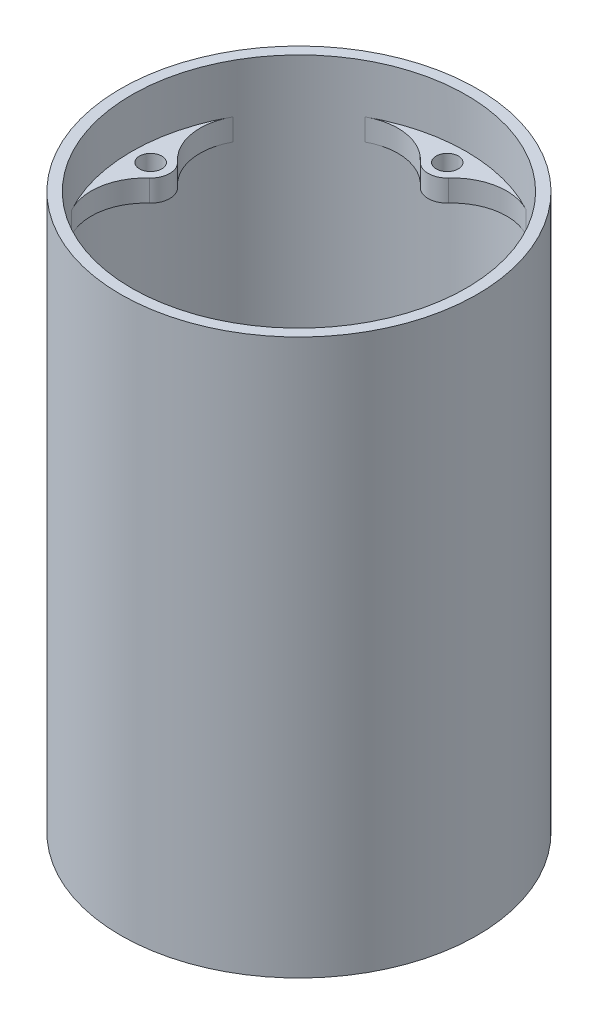
ISO-10303-21;
HEADER;
FILE_DESCRIPTION(('STEP AP214'),'2;1');
FILE_NAME('part.step','',(''),(''),'','','');
FILE_SCHEMA(('AUTOMOTIVE_DESIGN { 1 0 10303 214 1 1 1 1 }'));
ENDSEC;
DATA;
#1=APPLICATION_CONTEXT('core data for automotive mechanical design processes');
#2=APPLICATION_PROTOCOL_DEFINITION('international standard','automotive_design',2000,#1);
#3=PRODUCT_CONTEXT('',#1,'mechanical');
#4=PRODUCT('Part','Part','',(#3));
#5=PRODUCT_RELATED_PRODUCT_CATEGORY('part','',(#4));
#6=PRODUCT_DEFINITION_FORMATION('','',#4);
#7=PRODUCT_DEFINITION_CONTEXT('part definition',#1,'design');
#8=PRODUCT_DEFINITION('design','',#6,#7);
#9=PRODUCT_DEFINITION_SHAPE('','',#8);
#10=(LENGTH_UNIT() NAMED_UNIT(*) SI_UNIT(.MILLI.,.METRE.));
#11=(NAMED_UNIT(*) PLANE_ANGLE_UNIT() SI_UNIT($,.RADIAN.));
#12=(NAMED_UNIT(*) SI_UNIT($,.STERADIAN.) SOLID_ANGLE_UNIT());
#13=UNCERTAINTY_MEASURE_WITH_UNIT(LENGTH_MEASURE(1.E-05),#10,'distance_accuracy_value','');
#14=(GEOMETRIC_REPRESENTATION_CONTEXT(3) GLOBAL_UNCERTAINTY_ASSIGNED_CONTEXT((#13)) GLOBAL_UNIT_ASSIGNED_CONTEXT((#10,
#11,#12)) REPRESENTATION_CONTEXT('',''));
#15=CARTESIAN_POINT('',(0.,0.,0.));
#16=DIRECTION('',(0.,0.,1.));
#17=DIRECTION('',(1.,0.,0.));
#18=AXIS2_PLACEMENT_3D('',#15,#16,#17);
#19=CARTESIAN_POINT('',(0.,102.,0.));
#20=DIRECTION('',(0.,-1.,0.));
#21=DIRECTION('',(0.,0.,-1.));
#22=AXIS2_PLACEMENT_3D('',#19,#20,#21);
#23=CYLINDRICAL_SURFACE('',#22,30.75);
#24=CARTESIAN_POINT('',(0.,102.,0.));
#25=DIRECTION('',(0.,1.,0.));
#26=DIRECTION('',(0.,0.,1.));
#27=AXIS2_PLACEMENT_3D('',#24,#25,#26);
#28=CIRCLE('',#27,30.75);
#29=CARTESIAN_POINT('',(0.,102.,30.75));
#30=VERTEX_POINT('',#29);
#31=EDGE_CURVE('E330',#30,#30,#28,.T.);
#32=ORIENTED_EDGE('',*,*,#31,.T.);
#33=EDGE_LOOP('',(#32));
#34=FACE_BOUND('',#33,.T.);
#35=CARTESIAN_POINT('',(0.,0.,0.));
#36=DIRECTION('',(0.,1.,0.));
#37=DIRECTION('',(0.,0.,1.));
#38=AXIS2_PLACEMENT_3D('',#35,#36,#37);
#39=CIRCLE('',#38,30.75);
#40=CARTESIAN_POINT('',(0.,0.,30.75));
#41=VERTEX_POINT('',#40);
#42=EDGE_CURVE('E327',#41,#41,#39,.T.);
#43=ORIENTED_EDGE('',*,*,#42,.F.);
#44=EDGE_LOOP('',(#43));
#45=FACE_BOUND('',#44,.T.);
#46=CARTESIAN_POINT('',(0.,93.,0.));
#47=DIRECTION('',(0.,1.,0.));
#48=DIRECTION('',(0.,0.,1.));
#49=AXIS2_PLACEMENT_3D('',#46,#47,#48);
#50=CIRCLE('',#49,30.75);
#51=CARTESIAN_POINT('',(14.8197760235976,93.,-26.9432132198519));
#52=VERTEX_POINT('',#51);
#53=CARTESIAN_POINT('',(-14.8197760235976,93.,-26.9432132198519));
#54=VERTEX_POINT('',#53);
#55=EDGE_CURVE('E258',#52,#54,#50,.T.);
#56=ORIENTED_EDGE('',*,*,#55,.F.);
#57=DIRECTION('',(0.,-1.,0.));
#58=VECTOR('',#57,1.);
#59=CARTESIAN_POINT('',(14.8197760235976,102.,-26.9432132198519));
#60=LINE('',#59,#58);
#61=CARTESIAN_POINT('',(14.8197760235976,89.,-26.9432132198519));
#62=VERTEX_POINT('',#61);
#63=EDGE_CURVE('E188',#52,#62,#60,.T.);
#64=ORIENTED_EDGE('',*,*,#63,.T.);
#65=CARTESIAN_POINT('',(0.,89.,0.));
#66=DIRECTION('',(0.,1.,0.));
#67=DIRECTION('',(0.,0.,1.));
#68=AXIS2_PLACEMENT_3D('',#65,#66,#67);
#69=CIRCLE('',#68,30.75);
#70=CARTESIAN_POINT('',(-14.8197760235976,89.,-26.9432132198519));
#71=VERTEX_POINT('',#70);
#72=EDGE_CURVE('E253',#62,#71,#69,.T.);
#73=ORIENTED_EDGE('',*,*,#72,.T.);
#74=DIRECTION('',(0.,-1.,0.));
#75=VECTOR('',#74,1.);
#76=CARTESIAN_POINT('',(-14.8197760235976,102.,-26.9432132198519));
#77=LINE('',#76,#75);
#78=EDGE_CURVE('E180',#71,#54,#77,.F.);
#79=ORIENTED_EDGE('',*,*,#78,.T.);
#80=EDGE_LOOP('',(#56,#64,#73,#79));
#81=FACE_BOUND('',#80,.T.);
#82=CARTESIAN_POINT('',(0.,93.,0.));
#83=DIRECTION('',(0.,1.,0.));
#84=DIRECTION('',(0.,0.,1.));
#85=AXIS2_PLACEMENT_3D('',#82,#83,#84);
#86=CIRCLE('',#85,30.75);
#87=CARTESIAN_POINT('',(26.9432132198518,93.,14.8197760235977));
#88=VERTEX_POINT('',#87);
#89=CARTESIAN_POINT('',(26.9432132198519,93.,-14.8197760235975));
#90=VERTEX_POINT('',#89);
#91=EDGE_CURVE('E156',#88,#90,#86,.T.);
#92=ORIENTED_EDGE('',*,*,#91,.F.);
#93=DIRECTION('',(0.,-1.,0.));
#94=VECTOR('',#93,1.);
#95=CARTESIAN_POINT('',(26.9432132198518,102.,14.8197760235977));
#96=LINE('',#95,#94);
#97=CARTESIAN_POINT('',(26.9432132198518,89.,14.8197760235977));
#98=VERTEX_POINT('',#97);
#99=EDGE_CURVE('E205',#88,#98,#96,.T.);
#100=ORIENTED_EDGE('',*,*,#99,.T.);
#101=CARTESIAN_POINT('',(0.,89.,0.));
#102=DIRECTION('',(0.,1.,0.));
#103=DIRECTION('',(0.,0.,1.));
#104=AXIS2_PLACEMENT_3D('',#101,#102,#103);
#105=CIRCLE('',#104,30.75);
#106=CARTESIAN_POINT('',(26.9432132198519,89.,-14.8197760235975));
#107=VERTEX_POINT('',#106);
#108=EDGE_CURVE('E261',#98,#107,#105,.T.);
#109=ORIENTED_EDGE('',*,*,#108,.T.);
#110=DIRECTION('',(0.,-1.,0.));
#111=VECTOR('',#110,1.);
#112=CARTESIAN_POINT('',(26.9432132198519,102.,-14.8197760235975));
#113=LINE('',#112,#111);
#114=EDGE_CURVE('E203',#107,#90,#113,.F.);
#115=ORIENTED_EDGE('',*,*,#114,.T.);
#116=EDGE_LOOP('',(#92,#100,#109,#115));
#117=FACE_BOUND('',#116,.T.);
#118=CARTESIAN_POINT('',(0.,93.,0.));
#119=DIRECTION('',(0.,1.,0.));
#120=DIRECTION('',(0.,0.,1.));
#121=AXIS2_PLACEMENT_3D('',#118,#119,#120);
#122=CIRCLE('',#121,30.75);
#123=CARTESIAN_POINT('',(-14.8197760235978,93.,26.9432132198518));
#124=VERTEX_POINT('',#123);
#125=CARTESIAN_POINT('',(14.8197760235974,93.,26.943213219852));
#126=VERTEX_POINT('',#125);
#127=EDGE_CURVE('E268',#124,#126,#122,.T.);
#128=ORIENTED_EDGE('',*,*,#127,.F.);
#129=DIRECTION('',(0.,-1.,0.));
#130=VECTOR('',#129,1.);
#131=CARTESIAN_POINT('',(-14.8197760235978,102.,26.9432132198518));
#132=LINE('',#131,#130);
#133=CARTESIAN_POINT('',(-14.8197760235978,89.,26.9432132198518));
#134=VERTEX_POINT('',#133);
#135=EDGE_CURVE('E200',#124,#134,#132,.T.);
#136=ORIENTED_EDGE('',*,*,#135,.T.);
#137=CARTESIAN_POINT('',(0.,89.,0.));
#138=DIRECTION('',(0.,1.,0.));
#139=DIRECTION('',(0.,0.,1.));
#140=AXIS2_PLACEMENT_3D('',#137,#138,#139);
#141=CIRCLE('',#140,30.75);
#142=CARTESIAN_POINT('',(14.8197760235974,89.,26.943213219852));
#143=VERTEX_POINT('',#142);
#144=EDGE_CURVE('E270',#134,#143,#141,.T.);
#145=ORIENTED_EDGE('',*,*,#144,.T.);
#146=DIRECTION('',(0.,-1.,0.));
#147=VECTOR('',#146,1.);
#148=CARTESIAN_POINT('',(14.8197760235974,102.,26.943213219852));
#149=LINE('',#148,#147);
#150=EDGE_CURVE('E197',#143,#126,#149,.F.);
#151=ORIENTED_EDGE('',*,*,#150,.T.);
#152=EDGE_LOOP('',(#128,#136,#145,#151));
#153=FACE_BOUND('',#152,.T.);
#154=CARTESIAN_POINT('',(0.,93.,0.));
#155=DIRECTION('',(0.,1.,0.));
#156=DIRECTION('',(0.,0.,1.));
#157=AXIS2_PLACEMENT_3D('',#154,#155,#156);
#158=CIRCLE('',#157,30.75);
#159=CARTESIAN_POINT('',(-26.9432132198517,93.,-14.8197760235979));
#160=VERTEX_POINT('',#159);
#161=CARTESIAN_POINT('',(-26.943213219852,93.,14.8197760235973));
#162=VERTEX_POINT('',#161);
#163=EDGE_CURVE('E182',#160,#162,#158,.T.);
#164=ORIENTED_EDGE('',*,*,#163,.F.);
#165=DIRECTION('',(0.,-1.,0.));
#166=VECTOR('',#165,1.);
#167=CARTESIAN_POINT('',(-26.9432132198517,102.,-14.8197760235979));
#168=LINE('',#167,#166);
#169=CARTESIAN_POINT('',(-26.9432132198517,89.,-14.8197760235979));
#170=VERTEX_POINT('',#169);
#171=EDGE_CURVE('E194',#160,#170,#168,.T.);
#172=ORIENTED_EDGE('',*,*,#171,.T.);
#173=CARTESIAN_POINT('',(0.,89.,0.));
#174=DIRECTION('',(0.,1.,0.));
#175=DIRECTION('',(0.,0.,1.));
#176=AXIS2_PLACEMENT_3D('',#173,#174,#175);
#177=CIRCLE('',#176,30.75);
#178=CARTESIAN_POINT('',(-26.943213219852,89.,14.8197760235973));
#179=VERTEX_POINT('',#178);
#180=EDGE_CURVE('E178',#170,#179,#177,.T.);
#181=ORIENTED_EDGE('',*,*,#180,.T.);
#182=DIRECTION('',(0.,-1.,0.));
#183=VECTOR('',#182,1.);
#184=CARTESIAN_POINT('',(-26.9432132198521,102.,14.8197760235973));
#185=LINE('',#184,#183);
#186=EDGE_CURVE('E191',#179,#162,#185,.F.);
#187=ORIENTED_EDGE('',*,*,#186,.T.);
#188=EDGE_LOOP('',(#164,#172,#181,#187));
#189=FACE_BOUND('',#188,.T.);
#190=ADVANCED_FACE('F37',(#34,#45,#81,#117,#153,#189),#23,.F.);
#191=CARTESIAN_POINT('',(0.,102.,0.));
#192=DIRECTION('',(0.,1.,0.));
#193=DIRECTION('',(0.,0.,1.));
#194=AXIS2_PLACEMENT_3D('',#191,#192,#193);
#195=PLANE('',#194);
#196=CARTESIAN_POINT('',(0.,102.,0.));
#197=DIRECTION('',(0.,1.,0.));
#198=DIRECTION('',(0.,0.,1.));
#199=AXIS2_PLACEMENT_3D('',#196,#197,#198);
#200=CIRCLE('',#199,32.75);
#201=CARTESIAN_POINT('',(0.,102.,32.75));
#202=VERTEX_POINT('',#201);
#203=EDGE_CURVE('E263',#202,#202,#200,.T.);
#204=ORIENTED_EDGE('',*,*,#203,.T.);
#205=EDGE_LOOP('',(#204));
#206=FACE_BOUND('',#205,.T.);
#207=ORIENTED_EDGE('',*,*,#31,.F.);
#208=EDGE_LOOP('',(#207));
#209=FACE_BOUND('',#208,.T.);
#210=ADVANCED_FACE('F345',(#206,#209),#195,.T.);
#211=CARTESIAN_POINT('',(0.,0.,0.));
#212=DIRECTION('',(0.,1.,0.));
#213=DIRECTION('',(0.,0.,1.));
#214=AXIS2_PLACEMENT_3D('',#211,#212,#213);
#215=PLANE('',#214);
#216=CARTESIAN_POINT('',(0.,0.,0.));
#217=DIRECTION('',(0.,1.,0.));
#218=DIRECTION('',(0.,0.,1.));
#219=AXIS2_PLACEMENT_3D('',#216,#217,#218);
#220=CIRCLE('',#219,32.75);
#221=CARTESIAN_POINT('',(0.,0.,32.75));
#222=VERTEX_POINT('',#221);
#223=EDGE_CURVE('E333',#222,#222,#220,.T.);
#224=ORIENTED_EDGE('',*,*,#223,.F.);
#225=EDGE_LOOP('',(#224));
#226=FACE_BOUND('',#225,.T.);
#227=ORIENTED_EDGE('',*,*,#42,.T.);
#228=EDGE_LOOP('',(#227));
#229=FACE_BOUND('',#228,.T.);
#230=ADVANCED_FACE('F342',(#226,#229),#215,.F.);
#231=CARTESIAN_POINT('',(0.,102.,0.));
#232=DIRECTION('',(0.,-1.,0.));
#233=DIRECTION('',(0.,0.,-1.));
#234=AXIS2_PLACEMENT_3D('',#231,#232,#233);
#235=CYLINDRICAL_SURFACE('',#234,32.75);
#236=ORIENTED_EDGE('',*,*,#203,.F.);
#237=EDGE_LOOP('',(#236));
#238=FACE_BOUND('',#237,.T.);
#239=ORIENTED_EDGE('',*,*,#223,.T.);
#240=EDGE_LOOP('',(#239));
#241=FACE_BOUND('',#240,.T.);
#242=ADVANCED_FACE('F340',(#238,#241),#235,.T.);
#243=CARTESIAN_POINT('',(0.,89.,-27.25));
#244=DIRECTION('',(0.,1.,0.));
#245=DIRECTION('',(0.,0.,1.));
#246=AXIS2_PLACEMENT_3D('',#243,#244,#245);
#247=PLANE('',#246);
#248=CARTESIAN_POINT('',(0.,89.,-27.25));
#249=DIRECTION('',(0.,1.,0.));
#250=DIRECTION('',(0.,0.,1.));
#251=AXIS2_PLACEMENT_3D('',#248,#249,#250);
#252=CIRCLE('',#251,2.05);
#253=CARTESIAN_POINT('',(0.,89.,-25.2));
#254=VERTEX_POINT('',#253);
#255=EDGE_CURVE('E320',#254,#254,#252,.T.);
#256=ORIENTED_EDGE('',*,*,#255,.T.);
#257=EDGE_LOOP('',(#256));
#258=FACE_BOUND('',#257,.T.);
#259=ORIENTED_EDGE('',*,*,#72,.F.);
#260=CARTESIAN_POINT('',(10.0003366663301,89.,-18.1811926605505));
#261=DIRECTION('',(0.,1.,0.));
#262=DIRECTION('',(0.,0.,1.));
#263=AXIS2_PLACEMENT_3D('',#260,#261,#262);
#264=CIRCLE('',#263,10.);
#265=CARTESIAN_POINT('',(2.59267987645595,89.,-24.8988277268094));
#266=VERTEX_POINT('',#265);
#267=EDGE_CURVE('E52',#62,#266,#264,.T.);
#268=ORIENTED_EDGE('',*,*,#267,.T.);
#269=CARTESIAN_POINT('',(0.,89.,-27.25));
#270=DIRECTION('',(0.,1.,0.));
#271=DIRECTION('',(0.,0.,1.));
#272=AXIS2_PLACEMENT_3D('',#269,#270,#271);
#273=CIRCLE('',#272,3.5);
#274=CARTESIAN_POINT('',(-2.59267987645595,89.,-24.8988277268094));
#275=VERTEX_POINT('',#274);
#276=EDGE_CURVE('E254',#275,#266,#273,.T.);
#277=ORIENTED_EDGE('',*,*,#276,.F.);
#278=CARTESIAN_POINT('',(-10.0003366663301,89.,-18.1811926605505));
#279=DIRECTION('',(0.,1.,0.));
#280=DIRECTION('',(0.,0.,1.));
#281=AXIS2_PLACEMENT_3D('',#278,#279,#280);
#282=CIRCLE('',#281,10.);
#283=EDGE_CURVE('E45',#275,#71,#282,.T.);
#284=ORIENTED_EDGE('',*,*,#283,.T.);
#285=EDGE_LOOP('',(#259,#268,#277,#284));
#286=FACE_BOUND('',#285,.T.);
#287=ADVANCED_FACE('F252',(#258,#286),#247,.F.);
#288=CARTESIAN_POINT('',(0.,93.,-27.25));
#289=DIRECTION('',(0.,1.,0.));
#290=DIRECTION('',(0.,0.,1.));
#291=AXIS2_PLACEMENT_3D('',#288,#289,#290);
#292=PLANE('',#291);
#293=CARTESIAN_POINT('',(0.,93.,-27.25));
#294=DIRECTION('',(0.,1.,0.));
#295=DIRECTION('',(0.,0.,1.));
#296=AXIS2_PLACEMENT_3D('',#293,#294,#295);
#297=CIRCLE('',#296,2.05);
#298=CARTESIAN_POINT('',(0.,93.,-25.2));
#299=VERTEX_POINT('',#298);
#300=EDGE_CURVE('E317',#299,#299,#297,.T.);
#301=ORIENTED_EDGE('',*,*,#300,.F.);
#302=EDGE_LOOP('',(#301));
#303=FACE_BOUND('',#302,.T.);
#304=CARTESIAN_POINT('',(0.,93.,-27.25));
#305=DIRECTION('',(0.,1.,0.));
#306=DIRECTION('',(0.,0.,1.));
#307=AXIS2_PLACEMENT_3D('',#304,#305,#306);
#308=CIRCLE('',#307,3.5);
#309=CARTESIAN_POINT('',(-2.59267987645595,93.,-24.8988277268094));
#310=VERTEX_POINT('',#309);
#311=CARTESIAN_POINT('',(2.59267987645595,93.,-24.8988277268094));
#312=VERTEX_POINT('',#311);
#313=EDGE_CURVE('E323',#310,#312,#308,.T.);
#314=ORIENTED_EDGE('',*,*,#313,.T.);
#315=CARTESIAN_POINT('',(10.0003366663301,93.,-18.1811926605505));
#316=DIRECTION('',(0.,1.,0.));
#317=DIRECTION('',(0.,0.,1.));
#318=AXIS2_PLACEMENT_3D('',#315,#316,#317);
#319=CIRCLE('',#318,10.);
#320=EDGE_CURVE('E249',#312,#52,#319,.F.);
#321=ORIENTED_EDGE('',*,*,#320,.T.);
#322=ORIENTED_EDGE('',*,*,#55,.T.);
#323=CARTESIAN_POINT('',(-10.0003366663301,93.,-18.1811926605505));
#324=DIRECTION('',(0.,1.,0.));
#325=DIRECTION('',(0.,0.,1.));
#326=AXIS2_PLACEMENT_3D('',#323,#324,#325);
#327=CIRCLE('',#326,10.);
#328=EDGE_CURVE('E11',#54,#310,#327,.F.);
#329=ORIENTED_EDGE('',*,*,#328,.T.);
#330=EDGE_LOOP('',(#314,#321,#322,#329));
#331=FACE_BOUND('',#330,.T.);
#332=ADVANCED_FACE('F396',(#303,#331),#292,.T.);
#333=CARTESIAN_POINT('',(0.,89.,-27.25));
#334=DIRECTION('',(0.,1.,0.));
#335=DIRECTION('',(0.,0.,1.));
#336=AXIS2_PLACEMENT_3D('',#333,#334,#335);
#337=CYLINDRICAL_SURFACE('',#336,3.5);
#338=ORIENTED_EDGE('',*,*,#276,.T.);
#339=DIRECTION('',(0.,1.,0.));
#340=VECTOR('',#339,1.);
#341=CARTESIAN_POINT('',(2.59267987645595,89.,-24.8988277268094));
#342=LINE('',#341,#340);
#343=EDGE_CURVE('E222',#266,#312,#342,.T.);
#344=ORIENTED_EDGE('',*,*,#343,.T.);
#345=ORIENTED_EDGE('',*,*,#313,.F.);
#346=DIRECTION('',(0.,1.,0.));
#347=VECTOR('',#346,1.);
#348=CARTESIAN_POINT('',(-2.59267987645595,89.,-24.8988277268094));
#349=LINE('',#348,#347);
#350=EDGE_CURVE('E220',#310,#275,#349,.F.);
#351=ORIENTED_EDGE('',*,*,#350,.T.);
#352=EDGE_LOOP('',(#338,#344,#345,#351));
#353=FACE_BOUND('',#352,.T.);
#354=ADVANCED_FACE('F360',(#353),#337,.T.);
#355=CARTESIAN_POINT('',(0.,89.,-27.25));
#356=DIRECTION('',(0.,1.,0.));
#357=DIRECTION('',(0.,0.,1.));
#358=AXIS2_PLACEMENT_3D('',#355,#356,#357);
#359=CYLINDRICAL_SURFACE('',#358,2.05);
#360=ORIENTED_EDGE('',*,*,#255,.F.);
#361=EDGE_LOOP('',(#360));
#362=FACE_BOUND('',#361,.T.);
#363=ORIENTED_EDGE('',*,*,#300,.T.);
#364=EDGE_LOOP('',(#363));
#365=FACE_BOUND('',#364,.T.);
#366=ADVANCED_FACE('F402',(#362,#365),#359,.F.);
#367=CARTESIAN_POINT('',(27.25,89.,0.));
#368=DIRECTION('',(0.,1.,0.));
#369=DIRECTION('',(0.,0.,1.));
#370=AXIS2_PLACEMENT_3D('',#367,#368,#369);
#371=PLANE('',#370);
#372=CARTESIAN_POINT('',(27.25,89.,0.));
#373=DIRECTION('',(0.,1.,0.));
#374=DIRECTION('',(0.,0.,1.));
#375=AXIS2_PLACEMENT_3D('',#372,#373,#374);
#376=CIRCLE('',#375,2.05);
#377=CARTESIAN_POINT('',(27.25,89.,2.0500000000001));
#378=VERTEX_POINT('',#377);
#379=EDGE_CURVE('E173',#378,#378,#376,.T.);
#380=ORIENTED_EDGE('',*,*,#379,.T.);
#381=EDGE_LOOP('',(#380));
#382=FACE_BOUND('',#381,.T.);
#383=ORIENTED_EDGE('',*,*,#108,.F.);
#384=CARTESIAN_POINT('',(18.1811926605504,89.,10.0003366663302));
#385=DIRECTION('',(0.,1.,0.));
#386=DIRECTION('',(0.,0.,1.));
#387=AXIS2_PLACEMENT_3D('',#384,#385,#386);
#388=CIRCLE('',#387,10.);
#389=CARTESIAN_POINT('',(24.8988277268094,89.,2.59267987645604));
#390=VERTEX_POINT('',#389);
#391=EDGE_CURVE('E227',#98,#390,#388,.T.);
#392=ORIENTED_EDGE('',*,*,#391,.T.);
#393=CARTESIAN_POINT('',(27.25,89.,0.));
#394=DIRECTION('',(0.,1.,0.));
#395=DIRECTION('',(0.,0.,1.));
#396=AXIS2_PLACEMENT_3D('',#393,#394,#395);
#397=CIRCLE('',#396,3.5);
#398=CARTESIAN_POINT('',(24.8988277268094,89.,-2.59267987645586));
#399=VERTEX_POINT('',#398);
#400=EDGE_CURVE('E174',#399,#390,#397,.T.);
#401=ORIENTED_EDGE('',*,*,#400,.F.);
#402=CARTESIAN_POINT('',(18.1811926605505,89.,-10.00033666633));
#403=DIRECTION('',(0.,1.,0.));
#404=DIRECTION('',(0.,0.,1.));
#405=AXIS2_PLACEMENT_3D('',#402,#403,#404);
#406=CIRCLE('',#405,10.);
#407=EDGE_CURVE('E162',#399,#107,#406,.T.);
#408=ORIENTED_EDGE('',*,*,#407,.T.);
#409=EDGE_LOOP('',(#383,#392,#401,#408));
#410=FACE_BOUND('',#409,.T.);
#411=ADVANCED_FACE('F409',(#382,#410),#371,.F.);
#412=CARTESIAN_POINT('',(27.25,93.,0.));
#413=DIRECTION('',(0.,1.,0.));
#414=DIRECTION('',(0.,0.,1.));
#415=AXIS2_PLACEMENT_3D('',#412,#413,#414);
#416=PLANE('',#415);
#417=CARTESIAN_POINT('',(27.25,93.,0.));
#418=DIRECTION('',(0.,1.,0.));
#419=DIRECTION('',(0.,0.,1.));
#420=AXIS2_PLACEMENT_3D('',#417,#418,#419);
#421=CIRCLE('',#420,2.05);
#422=CARTESIAN_POINT('',(27.25,93.,2.0500000000001));
#423=VERTEX_POINT('',#422);
#424=EDGE_CURVE('E314',#423,#423,#421,.T.);
#425=ORIENTED_EDGE('',*,*,#424,.F.);
#426=EDGE_LOOP('',(#425));
#427=FACE_BOUND('',#426,.T.);
#428=CARTESIAN_POINT('',(27.25,93.,0.));
#429=DIRECTION('',(0.,1.,0.));
#430=DIRECTION('',(0.,0.,1.));
#431=AXIS2_PLACEMENT_3D('',#428,#429,#430);
#432=CIRCLE('',#431,3.5);
#433=CARTESIAN_POINT('',(24.8988277268094,93.,-2.59267987645586));
#434=VERTEX_POINT('',#433);
#435=CARTESIAN_POINT('',(24.8988277268094,93.,2.59267987645604));
#436=VERTEX_POINT('',#435);
#437=EDGE_CURVE('E155',#434,#436,#432,.T.);
#438=ORIENTED_EDGE('',*,*,#437,.T.);
#439=CARTESIAN_POINT('',(18.1811926605504,93.,10.0003366663302));
#440=DIRECTION('',(0.,1.,0.));
#441=DIRECTION('',(0.,0.,1.));
#442=AXIS2_PLACEMENT_3D('',#439,#440,#441);
#443=CIRCLE('',#442,10.);
#444=EDGE_CURVE('E225',#436,#88,#443,.F.);
#445=ORIENTED_EDGE('',*,*,#444,.T.);
#446=ORIENTED_EDGE('',*,*,#91,.T.);
#447=CARTESIAN_POINT('',(18.1811926605505,93.,-10.00033666633));
#448=DIRECTION('',(0.,1.,0.));
#449=DIRECTION('',(0.,0.,1.));
#450=AXIS2_PLACEMENT_3D('',#447,#448,#449);
#451=CIRCLE('',#450,10.);
#452=EDGE_CURVE('E151',#90,#434,#451,.F.);
#453=ORIENTED_EDGE('',*,*,#452,.T.);
#454=EDGE_LOOP('',(#438,#445,#446,#453));
#455=FACE_BOUND('',#454,.T.);
#456=ADVANCED_FACE('F153',(#427,#455),#416,.T.);
#457=CARTESIAN_POINT('',(27.25,89.,0.));
#458=DIRECTION('',(0.,1.,0.));
#459=DIRECTION('',(0.,0.,1.));
#460=AXIS2_PLACEMENT_3D('',#457,#458,#459);
#461=CYLINDRICAL_SURFACE('',#460,3.5);
#462=ORIENTED_EDGE('',*,*,#400,.T.);
#463=DIRECTION('',(0.,1.,0.));
#464=VECTOR('',#463,1.);
#465=CARTESIAN_POINT('',(24.8988277268094,89.,2.59267987645604));
#466=LINE('',#465,#464);
#467=EDGE_CURVE('E172',#390,#436,#466,.T.);
#468=ORIENTED_EDGE('',*,*,#467,.T.);
#469=ORIENTED_EDGE('',*,*,#437,.F.);
#470=DIRECTION('',(0.,1.,0.));
#471=VECTOR('',#470,1.);
#472=CARTESIAN_POINT('',(24.8988277268094,89.,-2.59267987645586));
#473=LINE('',#472,#471);
#474=EDGE_CURVE('E169',#434,#399,#473,.F.);
#475=ORIENTED_EDGE('',*,*,#474,.T.);
#476=EDGE_LOOP('',(#462,#468,#469,#475));
#477=FACE_BOUND('',#476,.T.);
#478=ADVANCED_FACE('F168',(#477),#461,.T.);
#479=CARTESIAN_POINT('',(27.25,89.,0.));
#480=DIRECTION('',(0.,1.,0.));
#481=DIRECTION('',(0.,0.,1.));
#482=AXIS2_PLACEMENT_3D('',#479,#480,#481);
#483=CYLINDRICAL_SURFACE('',#482,2.05);
#484=ORIENTED_EDGE('',*,*,#379,.F.);
#485=EDGE_LOOP('',(#484));
#486=FACE_BOUND('',#485,.T.);
#487=ORIENTED_EDGE('',*,*,#424,.T.);
#488=EDGE_LOOP('',(#487));
#489=FACE_BOUND('',#488,.T.);
#490=ADVANCED_FACE('F411',(#486,#489),#483,.F.);
#491=CARTESIAN_POINT('',(-1.90714359346652E-13,89.,27.25));
#492=DIRECTION('',(0.,1.,0.));
#493=DIRECTION('',(0.,0.,1.));
#494=AXIS2_PLACEMENT_3D('',#491,#492,#493);
#495=PLANE('',#494);
#496=CARTESIAN_POINT('',(-1.90714359346652E-13,89.,27.25));
#497=DIRECTION('',(0.,1.,0.));
#498=DIRECTION('',(0.,0.,1.));
#499=AXIS2_PLACEMENT_3D('',#496,#497,#498);
#500=CIRCLE('',#499,2.05);
#501=CARTESIAN_POINT('',(-1.90714359346652E-13,89.,29.3));
#502=VERTEX_POINT('',#501);
#503=EDGE_CURVE('E305',#502,#502,#500,.T.);
#504=ORIENTED_EDGE('',*,*,#503,.T.);
#505=EDGE_LOOP('',(#504));
#506=FACE_BOUND('',#505,.T.);
#507=ORIENTED_EDGE('',*,*,#144,.F.);
#508=CARTESIAN_POINT('',(-10.0003366663302,89.,18.1811926605504));
#509=DIRECTION('',(0.,1.,0.));
#510=DIRECTION('',(0.,0.,1.));
#511=AXIS2_PLACEMENT_3D('',#508,#509,#510);
#512=CIRCLE('',#511,10.);
#513=CARTESIAN_POINT('',(-2.59267987645613,89.,24.8988277268094));
#514=VERTEX_POINT('',#513);
#515=EDGE_CURVE('E232',#134,#514,#512,.T.);
#516=ORIENTED_EDGE('',*,*,#515,.T.);
#517=CARTESIAN_POINT('',(-1.90714359346652E-13,89.,27.25));
#518=DIRECTION('',(0.,1.,0.));
#519=DIRECTION('',(0.,0.,1.));
#520=AXIS2_PLACEMENT_3D('',#517,#518,#519);
#521=CIRCLE('',#520,3.5);
#522=CARTESIAN_POINT('',(2.59267987645578,89.,24.8988277268094));
#523=VERTEX_POINT('',#522);
#524=EDGE_CURVE('E299',#523,#514,#521,.T.);
#525=ORIENTED_EDGE('',*,*,#524,.F.);
#526=CARTESIAN_POINT('',(10.00033666633,89.,18.1811926605505));
#527=DIRECTION('',(0.,1.,0.));
#528=DIRECTION('',(0.,0.,1.));
#529=AXIS2_PLACEMENT_3D('',#526,#527,#528);
#530=CIRCLE('',#529,10.);
#531=EDGE_CURVE('E234',#523,#143,#530,.T.);
#532=ORIENTED_EDGE('',*,*,#531,.T.);
#533=EDGE_LOOP('',(#507,#516,#525,#532));
#534=FACE_BOUND('',#533,.T.);
#535=ADVANCED_FACE('F414',(#506,#534),#495,.F.);
#536=CARTESIAN_POINT('',(-1.90714359346652E-13,93.,27.25));
#537=DIRECTION('',(0.,1.,0.));
#538=DIRECTION('',(0.,0.,1.));
#539=AXIS2_PLACEMENT_3D('',#536,#537,#538);
#540=PLANE('',#539);
#541=CARTESIAN_POINT('',(-1.90714359346652E-13,93.,27.25));
#542=DIRECTION('',(0.,1.,0.));
#543=DIRECTION('',(0.,0.,1.));
#544=AXIS2_PLACEMENT_3D('',#541,#542,#543);
#545=CIRCLE('',#544,2.05);
#546=CARTESIAN_POINT('',(-1.90714359346652E-13,93.,29.3));
#547=VERTEX_POINT('',#546);
#548=EDGE_CURVE('E308',#547,#547,#545,.T.);
#549=ORIENTED_EDGE('',*,*,#548,.F.);
#550=EDGE_LOOP('',(#549));
#551=FACE_BOUND('',#550,.T.);
#552=CARTESIAN_POINT('',(-1.90714359346652E-13,93.,27.25));
#553=DIRECTION('',(0.,1.,0.));
#554=DIRECTION('',(0.,0.,1.));
#555=AXIS2_PLACEMENT_3D('',#552,#553,#554);
#556=CIRCLE('',#555,3.5);
#557=CARTESIAN_POINT('',(2.59267987645578,93.,24.8988277268094));
#558=VERTEX_POINT('',#557);
#559=CARTESIAN_POINT('',(-2.59267987645613,93.,24.8988277268094));
#560=VERTEX_POINT('',#559);
#561=EDGE_CURVE('E302',#558,#560,#556,.T.);
#562=ORIENTED_EDGE('',*,*,#561,.T.);
#563=CARTESIAN_POINT('',(-10.0003366663302,93.,18.1811926605504));
#564=DIRECTION('',(0.,1.,0.));
#565=DIRECTION('',(0.,0.,1.));
#566=AXIS2_PLACEMENT_3D('',#563,#564,#565);
#567=CIRCLE('',#566,10.);
#568=EDGE_CURVE('E161',#560,#124,#567,.F.);
#569=ORIENTED_EDGE('',*,*,#568,.T.);
#570=ORIENTED_EDGE('',*,*,#127,.T.);
#571=CARTESIAN_POINT('',(10.00033666633,93.,18.1811926605505));
#572=DIRECTION('',(0.,1.,0.));
#573=DIRECTION('',(0.,0.,1.));
#574=AXIS2_PLACEMENT_3D('',#571,#572,#573);
#575=CIRCLE('',#574,10.);
#576=EDGE_CURVE('E237',#126,#558,#575,.F.);
#577=ORIENTED_EDGE('',*,*,#576,.T.);
#578=EDGE_LOOP('',(#562,#569,#570,#577));
#579=FACE_BOUND('',#578,.T.);
#580=ADVANCED_FACE('F431',(#551,#579),#540,.T.);
#581=CARTESIAN_POINT('',(-1.90714359346652E-13,89.,27.25));
#582=DIRECTION('',(0.,1.,0.));
#583=DIRECTION('',(0.,0.,1.));
#584=AXIS2_PLACEMENT_3D('',#581,#582,#583);
#585=CYLINDRICAL_SURFACE('',#584,3.5);
#586=ORIENTED_EDGE('',*,*,#524,.T.);
#587=DIRECTION('',(0.,1.,0.));
#588=VECTOR('',#587,1.);
#589=CARTESIAN_POINT('',(-2.59267987645613,89.,24.8988277268094));
#590=LINE('',#589,#588);
#591=EDGE_CURVE('E211',#514,#560,#590,.T.);
#592=ORIENTED_EDGE('',*,*,#591,.T.);
#593=ORIENTED_EDGE('',*,*,#561,.F.);
#594=DIRECTION('',(0.,1.,0.));
#595=VECTOR('',#594,1.);
#596=CARTESIAN_POINT('',(2.59267987645578,89.,24.8988277268094));
#597=LINE('',#596,#595);
#598=EDGE_CURVE('E208',#558,#523,#597,.F.);
#599=ORIENTED_EDGE('',*,*,#598,.T.);
#600=EDGE_LOOP('',(#586,#592,#593,#599));
#601=FACE_BOUND('',#600,.T.);
#602=ADVANCED_FACE('F427',(#601),#585,.T.);
#603=CARTESIAN_POINT('',(-1.90714359346652E-13,89.,27.25));
#604=DIRECTION('',(0.,1.,0.));
#605=DIRECTION('',(0.,0.,1.));
#606=AXIS2_PLACEMENT_3D('',#603,#604,#605);
#607=CYLINDRICAL_SURFACE('',#606,2.05);
#608=ORIENTED_EDGE('',*,*,#503,.F.);
#609=EDGE_LOOP('',(#608));
#610=FACE_BOUND('',#609,.T.);
#611=ORIENTED_EDGE('',*,*,#548,.T.);
#612=EDGE_LOOP('',(#611));
#613=FACE_BOUND('',#612,.T.);
#614=ADVANCED_FACE('F424',(#610,#613),#607,.F.);
#615=CARTESIAN_POINT('',(-27.25,89.,-2.85857225830128E-13));
#616=DIRECTION('',(0.,1.,0.));
#617=DIRECTION('',(0.,0.,1.));
#618=AXIS2_PLACEMENT_3D('',#615,#616,#617);
#619=PLANE('',#618);
#620=CARTESIAN_POINT('',(-27.25,89.,-2.85857225830128E-13));
#621=DIRECTION('',(0.,1.,0.));
#622=DIRECTION('',(0.,0.,1.));
#623=AXIS2_PLACEMENT_3D('',#620,#621,#622);
#624=CIRCLE('',#623,2.05);
#625=CARTESIAN_POINT('',(-27.25,89.,2.04999999999971));
#626=VERTEX_POINT('',#625);
#627=EDGE_CURVE('E293',#626,#626,#624,.T.);
#628=ORIENTED_EDGE('',*,*,#627,.T.);
#629=EDGE_LOOP('',(#628));
#630=FACE_BOUND('',#629,.T.);
#631=ORIENTED_EDGE('',*,*,#180,.F.);
#632=CARTESIAN_POINT('',(-18.1811926605504,89.,-10.0003366663303));
#633=DIRECTION('',(0.,1.,0.));
#634=DIRECTION('',(0.,0.,1.));
#635=AXIS2_PLACEMENT_3D('',#632,#633,#634);
#636=CIRCLE('',#635,10.);
#637=CARTESIAN_POINT('',(-24.8988277268094,89.,-2.59267987645621));
#638=VERTEX_POINT('',#637);
#639=EDGE_CURVE('E242',#170,#638,#636,.T.);
#640=ORIENTED_EDGE('',*,*,#639,.T.);
#641=CARTESIAN_POINT('',(-27.25,89.,-2.85857225830128E-13));
#642=DIRECTION('',(0.,1.,0.));
#643=DIRECTION('',(0.,0.,1.));
#644=AXIS2_PLACEMENT_3D('',#641,#642,#643);
#645=CIRCLE('',#644,3.5);
#646=CARTESIAN_POINT('',(-24.8988277268094,89.,2.59267987645569));
#647=VERTEX_POINT('',#646);
#648=EDGE_CURVE('E286',#647,#638,#645,.T.);
#649=ORIENTED_EDGE('',*,*,#648,.F.);
#650=CARTESIAN_POINT('',(-18.1811926605506,89.,10.0003366663299));
#651=DIRECTION('',(0.,1.,0.));
#652=DIRECTION('',(0.,0.,1.));
#653=AXIS2_PLACEMENT_3D('',#650,#651,#652);
#654=CIRCLE('',#653,10.);
#655=EDGE_CURVE('E244',#647,#179,#654,.T.);
#656=ORIENTED_EDGE('',*,*,#655,.T.);
#657=EDGE_LOOP('',(#631,#640,#649,#656));
#658=FACE_BOUND('',#657,.T.);
#659=ADVANCED_FACE('F290',(#630,#658),#619,.F.);
#660=CARTESIAN_POINT('',(-27.25,93.,-2.85857225830128E-13));
#661=DIRECTION('',(0.,1.,0.));
#662=DIRECTION('',(0.,0.,1.));
#663=AXIS2_PLACEMENT_3D('',#660,#661,#662);
#664=PLANE('',#663);
#665=CARTESIAN_POINT('',(-27.25,93.,-2.85857225830128E-13));
#666=DIRECTION('',(0.,1.,0.));
#667=DIRECTION('',(0.,0.,1.));
#668=AXIS2_PLACEMENT_3D('',#665,#666,#667);
#669=CIRCLE('',#668,2.05);
#670=CARTESIAN_POINT('',(-27.25,93.,2.04999999999971));
#671=VERTEX_POINT('',#670);
#672=EDGE_CURVE('E296',#671,#671,#669,.T.);
#673=ORIENTED_EDGE('',*,*,#672,.F.);
#674=EDGE_LOOP('',(#673));
#675=FACE_BOUND('',#674,.T.);
#676=CARTESIAN_POINT('',(-27.25,93.,-2.85857225830128E-13));
#677=DIRECTION('',(0.,1.,0.));
#678=DIRECTION('',(0.,0.,1.));
#679=AXIS2_PLACEMENT_3D('',#676,#677,#678);
#680=CIRCLE('',#679,3.5);
#681=CARTESIAN_POINT('',(-24.8988277268094,93.,2.59267987645569));
#682=VERTEX_POINT('',#681);
#683=CARTESIAN_POINT('',(-24.8988277268094,93.,-2.59267987645621));
#684=VERTEX_POINT('',#683);
#685=EDGE_CURVE('E288',#682,#684,#680,.T.);
#686=ORIENTED_EDGE('',*,*,#685,.T.);
#687=CARTESIAN_POINT('',(-18.1811926605504,93.,-10.0003366663303));
#688=DIRECTION('',(0.,1.,0.));
#689=DIRECTION('',(0.,0.,1.));
#690=AXIS2_PLACEMENT_3D('',#687,#688,#689);
#691=CIRCLE('',#690,10.);
#692=EDGE_CURVE('E239',#684,#160,#691,.F.);
#693=ORIENTED_EDGE('',*,*,#692,.T.);
#694=ORIENTED_EDGE('',*,*,#163,.T.);
#695=CARTESIAN_POINT('',(-18.1811926605506,93.,10.0003366663299));
#696=DIRECTION('',(0.,1.,0.));
#697=DIRECTION('',(0.,0.,1.));
#698=AXIS2_PLACEMENT_3D('',#695,#696,#697);
#699=CIRCLE('',#698,10.);
#700=EDGE_CURVE('E247',#162,#682,#699,.F.);
#701=ORIENTED_EDGE('',*,*,#700,.T.);
#702=EDGE_LOOP('',(#686,#693,#694,#701));
#703=FACE_BOUND('',#702,.T.);
#704=ADVANCED_FACE('F273',(#675,#703),#664,.T.);
#705=CARTESIAN_POINT('',(-27.25,89.,-2.85857225830128E-13));
#706=DIRECTION('',(0.,1.,0.));
#707=DIRECTION('',(0.,0.,1.));
#708=AXIS2_PLACEMENT_3D('',#705,#706,#707);
#709=CYLINDRICAL_SURFACE('',#708,3.5);
#710=ORIENTED_EDGE('',*,*,#648,.T.);
#711=DIRECTION('',(0.,1.,0.));
#712=VECTOR('',#711,1.);
#713=CARTESIAN_POINT('',(-24.8988277268094,89.,-2.59267987645621));
#714=LINE('',#713,#712);
#715=EDGE_CURVE('E217',#638,#684,#714,.T.);
#716=ORIENTED_EDGE('',*,*,#715,.T.);
#717=ORIENTED_EDGE('',*,*,#685,.F.);
#718=DIRECTION('',(0.,1.,0.));
#719=VECTOR('',#718,1.);
#720=CARTESIAN_POINT('',(-24.8988277268094,89.,2.59267987645569));
#721=LINE('',#720,#719);
#722=EDGE_CURVE('E214',#682,#647,#721,.F.);
#723=ORIENTED_EDGE('',*,*,#722,.T.);
#724=EDGE_LOOP('',(#710,#716,#717,#723));
#725=FACE_BOUND('',#724,.T.);
#726=ADVANCED_FACE('F285',(#725),#709,.T.);
#727=CARTESIAN_POINT('',(-27.25,89.,-2.85857225830128E-13));
#728=DIRECTION('',(0.,1.,0.));
#729=DIRECTION('',(0.,0.,1.));
#730=AXIS2_PLACEMENT_3D('',#727,#728,#729);
#731=CYLINDRICAL_SURFACE('',#730,2.05);
#732=ORIENTED_EDGE('',*,*,#627,.F.);
#733=EDGE_LOOP('',(#732));
#734=FACE_BOUND('',#733,.T.);
#735=ORIENTED_EDGE('',*,*,#672,.T.);
#736=EDGE_LOOP('',(#735));
#737=FACE_BOUND('',#736,.T.);
#738=ADVANCED_FACE('F369',(#734,#737),#731,.F.);
#739=CARTESIAN_POINT('',(18.1811926605504,102.,10.0003366663302));
#740=DIRECTION('',(0.,1.,0.));
#741=DIRECTION('',(0.,0.,1.));
#742=AXIS2_PLACEMENT_3D('',#739,#740,#741);
#743=CYLINDRICAL_SURFACE('',#742,10.);
#744=ORIENTED_EDGE('',*,*,#391,.F.);
#745=ORIENTED_EDGE('',*,*,#99,.F.);
#746=ORIENTED_EDGE('',*,*,#444,.F.);
#747=ORIENTED_EDGE('',*,*,#467,.F.);
#748=EDGE_LOOP('',(#744,#745,#746,#747));
#749=FACE_BOUND('',#748,.T.);
#750=ADVANCED_FACE('F366',(#749),#743,.F.);
#751=CARTESIAN_POINT('',(18.1811926605505,102.,-10.00033666633));
#752=DIRECTION('',(0.,-1.,0.));
#753=DIRECTION('',(0.,0.,-1.));
#754=AXIS2_PLACEMENT_3D('',#751,#752,#753);
#755=CYLINDRICAL_SURFACE('',#754,10.);
#756=ORIENTED_EDGE('',*,*,#452,.F.);
#757=ORIENTED_EDGE('',*,*,#114,.F.);
#758=ORIENTED_EDGE('',*,*,#407,.F.);
#759=ORIENTED_EDGE('',*,*,#474,.F.);
#760=EDGE_LOOP('',(#756,#757,#758,#759));
#761=FACE_BOUND('',#760,.T.);
#762=ADVANCED_FACE('F176',(#761),#755,.F.);
#763=CARTESIAN_POINT('',(-10.0003366663302,102.,18.1811926605504));
#764=DIRECTION('',(0.,1.,0.));
#765=DIRECTION('',(0.,0.,1.));
#766=AXIS2_PLACEMENT_3D('',#763,#764,#765);
#767=CYLINDRICAL_SURFACE('',#766,10.);
#768=ORIENTED_EDGE('',*,*,#515,.F.);
#769=ORIENTED_EDGE('',*,*,#135,.F.);
#770=ORIENTED_EDGE('',*,*,#568,.F.);
#771=ORIENTED_EDGE('',*,*,#591,.F.);
#772=EDGE_LOOP('',(#768,#769,#770,#771));
#773=FACE_BOUND('',#772,.T.);
#774=ADVANCED_FACE('F373',(#773),#767,.F.);
#775=CARTESIAN_POINT('',(10.00033666633,102.,18.1811926605505));
#776=DIRECTION('',(0.,-1.,0.));
#777=DIRECTION('',(0.,0.,-1.));
#778=AXIS2_PLACEMENT_3D('',#775,#776,#777);
#779=CYLINDRICAL_SURFACE('',#778,10.);
#780=ORIENTED_EDGE('',*,*,#576,.F.);
#781=ORIENTED_EDGE('',*,*,#150,.F.);
#782=ORIENTED_EDGE('',*,*,#531,.F.);
#783=ORIENTED_EDGE('',*,*,#598,.F.);
#784=EDGE_LOOP('',(#780,#781,#782,#783));
#785=FACE_BOUND('',#784,.T.);
#786=ADVANCED_FACE('F376',(#785),#779,.F.);
#787=CARTESIAN_POINT('',(-18.1811926605504,102.,-10.0003366663303));
#788=DIRECTION('',(0.,1.,0.));
#789=DIRECTION('',(0.,0.,1.));
#790=AXIS2_PLACEMENT_3D('',#787,#788,#789);
#791=CYLINDRICAL_SURFACE('',#790,10.);
#792=ORIENTED_EDGE('',*,*,#639,.F.);
#793=ORIENTED_EDGE('',*,*,#171,.F.);
#794=ORIENTED_EDGE('',*,*,#692,.F.);
#795=ORIENTED_EDGE('',*,*,#715,.F.);
#796=EDGE_LOOP('',(#792,#793,#794,#795));
#797=FACE_BOUND('',#796,.T.);
#798=ADVANCED_FACE('F380',(#797),#791,.F.);
#799=CARTESIAN_POINT('',(-18.1811926605506,102.,10.0003366663299));
#800=DIRECTION('',(0.,-1.,0.));
#801=DIRECTION('',(0.,0.,-1.));
#802=AXIS2_PLACEMENT_3D('',#799,#800,#801);
#803=CYLINDRICAL_SURFACE('',#802,10.);
#804=ORIENTED_EDGE('',*,*,#700,.F.);
#805=ORIENTED_EDGE('',*,*,#186,.F.);
#806=ORIENTED_EDGE('',*,*,#655,.F.);
#807=ORIENTED_EDGE('',*,*,#722,.F.);
#808=EDGE_LOOP('',(#804,#805,#806,#807));
#809=FACE_BOUND('',#808,.T.);
#810=ADVANCED_FACE('F281',(#809),#803,.F.);
#811=CARTESIAN_POINT('',(10.0003366663301,102.,-18.1811926605505));
#812=DIRECTION('',(0.,1.,0.));
#813=DIRECTION('',(0.,0.,1.));
#814=AXIS2_PLACEMENT_3D('',#811,#812,#813);
#815=CYLINDRICAL_SURFACE('',#814,10.);
#816=ORIENTED_EDGE('',*,*,#267,.F.);
#817=ORIENTED_EDGE('',*,*,#63,.F.);
#818=ORIENTED_EDGE('',*,*,#320,.F.);
#819=ORIENTED_EDGE('',*,*,#343,.F.);
#820=EDGE_LOOP('',(#816,#817,#818,#819));
#821=FACE_BOUND('',#820,.T.);
#822=ADVANCED_FACE('F386',(#821),#815,.F.);
#823=CARTESIAN_POINT('',(-10.0003366663301,102.,-18.1811926605505));
#824=DIRECTION('',(0.,-1.,0.));
#825=DIRECTION('',(0.,0.,-1.));
#826=AXIS2_PLACEMENT_3D('',#823,#824,#825);
#827=CYLINDRICAL_SURFACE('',#826,10.);
#828=ORIENTED_EDGE('',*,*,#328,.F.);
#829=ORIENTED_EDGE('',*,*,#78,.F.);
#830=ORIENTED_EDGE('',*,*,#283,.F.);
#831=ORIENTED_EDGE('',*,*,#350,.F.);
#832=EDGE_LOOP('',(#828,#829,#830,#831));
#833=FACE_BOUND('',#832,.T.);
#834=ADVANCED_FACE('F39',(#833),#827,.F.);
#835=CLOSED_SHELL('',(#190,#210,#230,#242,#287,#332,#354,#366,#411,#456,#478,#490,#535,#580,
#602,#614,#659,#704,#726,#738,#750,#762,#774,#786,#798,#810,#822,#834));
#836=MANIFOLD_SOLID_BREP('B2',#835);
#837=ADVANCED_BREP_SHAPE_REPRESENTATION('',(#18,#836),#14);
#838=SHAPE_DEFINITION_REPRESENTATION(#9,#837);
ENDSEC;
END-ISO-10303-21;
